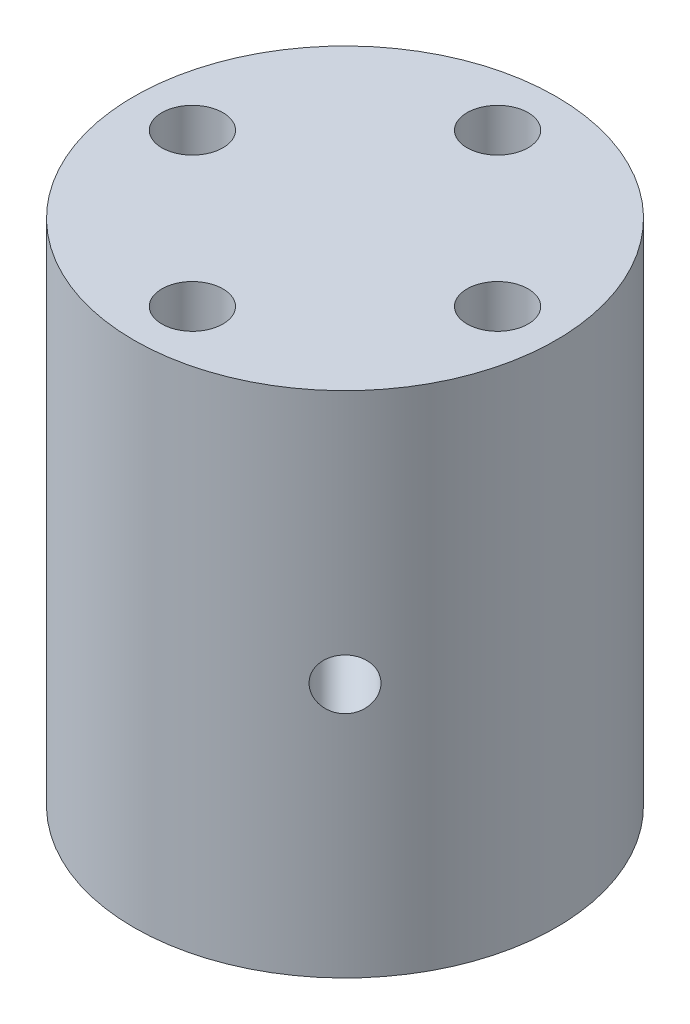
ISO-10303-21;
HEADER;
FILE_DESCRIPTION(('STEP AP214'),'2;1');
FILE_NAME('part.step','',(''),(''),'','','');
FILE_SCHEMA(('AUTOMOTIVE_DESIGN { 1 0 10303 214 1 1 1 1 }'));
ENDSEC;
DATA;
#1=APPLICATION_CONTEXT('core data for automotive mechanical design processes');
#2=APPLICATION_PROTOCOL_DEFINITION('international standard','automotive_design',2000,#1);
#3=PRODUCT_CONTEXT('',#1,'mechanical');
#4=PRODUCT('Part','Part','',(#3));
#5=PRODUCT_RELATED_PRODUCT_CATEGORY('part','',(#4));
#6=PRODUCT_DEFINITION_FORMATION('','',#4);
#7=PRODUCT_DEFINITION_CONTEXT('part definition',#1,'design');
#8=PRODUCT_DEFINITION('design','',#6,#7);
#9=PRODUCT_DEFINITION_SHAPE('','',#8);
#10=(LENGTH_UNIT() NAMED_UNIT(*) SI_UNIT(.MILLI.,.METRE.));
#11=(NAMED_UNIT(*) PLANE_ANGLE_UNIT() SI_UNIT($,.RADIAN.));
#12=(NAMED_UNIT(*) SI_UNIT($,.STERADIAN.) SOLID_ANGLE_UNIT());
#13=UNCERTAINTY_MEASURE_WITH_UNIT(LENGTH_MEASURE(1.E-05),#10,'distance_accuracy_value','');
#14=(GEOMETRIC_REPRESENTATION_CONTEXT(3) GLOBAL_UNCERTAINTY_ASSIGNED_CONTEXT((#13)) GLOBAL_UNIT_ASSIGNED_CONTEXT((#10,
#11,#12)) REPRESENTATION_CONTEXT('',''));
#15=CARTESIAN_POINT('',(0.,0.,0.));
#16=DIRECTION('',(0.,0.,1.));
#17=DIRECTION('',(1.,0.,0.));
#18=AXIS2_PLACEMENT_3D('',#15,#16,#17);
#19=CARTESIAN_POINT('',(0.,25.,0.));
#20=DIRECTION('',(0.,-1.,0.));
#21=DIRECTION('',(0.,0.,-1.));
#22=AXIS2_PLACEMENT_3D('',#19,#20,#21);
#23=CYLINDRICAL_SURFACE('',#22,10.375);
#24=CARTESIAN_POINT('',(-6.39890874216484,12.5,-8.16667569513118));
#25=CARTESIAN_POINT('',(-6.39891154089211,12.5699391173914,-8.16667427177952));
#26=CARTESIAN_POINT('',(-6.40358247484263,12.6399224468724,-8.16302031034799));
#27=CARTESIAN_POINT('',(-6.42210039944949,12.7779429061025,-8.14845904761087));
#28=CARTESIAN_POINT('',(-6.43595708190464,12.8459779010037,-8.13754408524727));
#29=CARTESIAN_POINT('',(-6.47230798956442,12.978083312131,-8.10866140554251));
#30=CARTESIAN_POINT('',(-6.49479647578836,13.0421563297413,-8.09069837403692));
#31=CARTESIAN_POINT('',(-6.5475703216428,13.1645803922889,-8.04804904711777));
#32=CARTESIAN_POINT('',(-6.57785430605795,13.2229324439656,-8.02336393751152));
#33=CARTESIAN_POINT('',(-6.645293320083,13.3325744824244,-7.96759809880234));
#34=CARTESIAN_POINT('',(-6.68247964507917,13.3838303690704,-7.93648816397078));
#35=CARTESIAN_POINT('',(-6.76233721005145,13.4775307229728,-7.86855532648686));
#36=CARTESIAN_POINT('',(-6.80500871830821,13.5199747589752,-7.83173214438095));
#37=CARTESIAN_POINT('',(-6.89454044791258,13.5949681586704,-7.75303133287636));
#38=CARTESIAN_POINT('',(-6.94141311533498,13.6274867743933,-7.71113854702754));
#39=CARTESIAN_POINT('',(-7.03770008295615,13.6815093569917,-7.62336158146409));
#40=CARTESIAN_POINT('',(-7.08711429516507,13.7030137049059,-7.57747753989122));
#41=CARTESIAN_POINT('',(-7.18667938050284,13.7342957494894,-7.48311057077701));
#42=CARTESIAN_POINT('',(-7.23682549505209,13.744130036319,-7.43464138575934));
#43=CARTESIAN_POINT('',(-7.33658124852993,13.751968125605,-7.33621897801879));
#44=CARTESIAN_POINT('',(-7.38619090708207,13.7499723622812,-7.28626580983221));
#45=CARTESIAN_POINT('',(-7.48321150054099,13.7342524700575,-7.18658367291414));
#46=CARTESIAN_POINT('',(-7.53063250121661,13.7205892001374,-7.1368548845044));
#47=CARTESIAN_POINT('',(-7.62230677029678,13.6820172160672,-7.03886137374923));
#48=CARTESIAN_POINT('',(-7.66655998210517,13.657108301059,-6.99059667757036));
#49=CARTESIAN_POINT('',(-7.75093581973229,13.5966869860383,-6.89692733673128));
#50=CARTESIAN_POINT('',(-7.79104780065824,13.561148132246,-6.85153017367705));
#51=CARTESIAN_POINT('',(-7.86612448233865,13.4804949931639,-6.76520424037887));
#52=CARTESIAN_POINT('',(-7.90108896363182,13.4353802998126,-6.72427566067015));
#53=CARTESIAN_POINT('',(-7.9653577156446,13.3365149798066,-6.64802294292893));
#54=CARTESIAN_POINT('',(-7.99462463300279,13.2827113325686,-6.61273604461652));
#55=CARTESIAN_POINT('',(-8.04665035991987,13.1681778609735,-6.5493305334591));
#56=CARTESIAN_POINT('',(-8.06940915160002,13.1074480175898,-6.52121194030647));
#57=CARTESIAN_POINT('',(-8.1080016061926,12.9807403272261,-6.47316688968925));
#58=CARTESIAN_POINT('',(-8.12383265547643,12.9147605106647,-6.45324352420715));
#59=CARTESIAN_POINT('',(-8.14826618806097,12.7794493504251,-6.42236516953996));
#60=CARTESIAN_POINT('',(-8.1568689942041,12.7101181565793,-6.41140977980957));
#61=CARTESIAN_POINT('',(-8.16665955759412,12.5705375908634,-6.39893430640159));
#62=CARTESIAN_POINT('',(-8.16789345594521,12.5002966983874,-6.39735551064996));
#63=CARTESIAN_POINT('',(-8.16304739475467,12.3604827061468,-6.40353785430568));
#64=CARTESIAN_POINT('',(-8.15696757977726,12.2909095932103,-6.41129880910178));
#65=CARTESIAN_POINT('',(-8.13763418155867,12.1546270739253,-6.43581967951247));
#66=CARTESIAN_POINT('',(-8.12440301438145,12.0879094185811,-6.45255147453132));
#67=CARTESIAN_POINT('',(-8.09101862199573,11.9589739471632,-6.49436326066546));
#68=CARTESIAN_POINT('',(-8.07086516999174,11.8967562786039,-6.51944352530164));
#69=CARTESIAN_POINT('',(-8.02388636503463,11.7782509744571,-6.57717714599622));
#70=CARTESIAN_POINT('',(-7.99702871539336,11.7219939790415,-6.60986710790959));
#71=CARTESIAN_POINT('',(-7.93720012281331,11.6173192028496,-6.681590725392));
#72=CARTESIAN_POINT('',(-7.90422895926089,11.5689017050892,-6.72062460988298));
#73=CARTESIAN_POINT('',(-7.83264429475469,11.4810208075757,-6.80392049186991));
#74=CARTESIAN_POINT('',(-7.79400190866115,11.4416060581151,-6.84820901722718));
#75=CARTESIAN_POINT('',(-7.71205139137585,11.3731857595573,-6.94036636452378));
#76=CARTESIAN_POINT('',(-7.66874334849382,11.3441800134875,-6.98823511869269));
#77=CARTESIAN_POINT('',(-7.57860886748938,11.2974818408044,-7.08588121053625));
#78=CARTESIAN_POINT('',(-7.53179158395452,11.2797610493531,-7.13565342699532));
#79=CARTESIAN_POINT('',(-7.43575661981332,11.2560434775358,-7.23567221709084));
#80=CARTESIAN_POINT('',(-7.38653903947215,11.250046207884,-7.28591877084269));
#81=CARTESIAN_POINT('',(-7.28739335211641,11.2499546137136,-7.3850801166557));
#82=CARTESIAN_POINT('',(-7.23747171588608,11.2557851744907,-7.43400132599505));
#83=CARTESIAN_POINT('',(-7.1380768955065,11.2790249538295,-7.52949098434799));
#84=CARTESIAN_POINT('',(-7.08860371119515,11.2964341682053,-7.57605943421214));
#85=CARTESIAN_POINT('',(-6.99163713232038,11.3423140099138,-7.66563724911901));
#86=CARTESIAN_POINT('',(-6.94414314654363,11.3707813074391,-7.70864768082681));
#87=CARTESIAN_POINT('',(-6.85262606688713,11.4379614473246,-7.79011547219686));
#88=CARTESIAN_POINT('',(-6.80860300235291,11.4766743762962,-7.8285727933654));
#89=CARTESIAN_POINT('',(-6.72521659172878,11.5635256540314,-7.90032505010518));
#90=CARTESIAN_POINT('',(-6.68588323575865,11.6117199328331,-7.93358714243547));
#91=CARTESIAN_POINT('',(-6.61353153917336,11.7160503701426,-7.99400108201421));
#92=CARTESIAN_POINT('',(-6.58051469990478,11.7721884112678,-8.0211514768689));
#93=CARTESIAN_POINT('',(-6.52187951357402,11.8910426328447,-8.06890029204849));
#94=CARTESIAN_POINT('',(-6.49628817598141,11.9537817241934,-8.08947482022807));
#95=CARTESIAN_POINT('',(-6.45364095927438,12.0838579757672,-8.12353956381605));
#96=CARTESIAN_POINT('',(-6.43657572920803,12.1511900061605,-8.13703754119009));
#97=CARTESIAN_POINT('',(-6.4157416249637,12.2657310579037,-8.15346498382468));
#98=CARTESIAN_POINT('',(-6.40944066255573,12.3122155052239,-8.15841432859552));
#99=CARTESIAN_POINT('',(-6.40102329283336,12.405793283578,-8.16502015237656));
#100=CARTESIAN_POINT('',(-6.39890685684611,12.4528866104374,-8.16667665394971));
#101=CARTESIAN_POINT('',(-6.39890874216484,12.5,-8.16667569513118));
#102=B_SPLINE_CURVE_WITH_KNOTS('',3,(#24,#25,#26,#27,#28,#29,#30,#31,#32,#33,#34,#35,#36,#37,
#38,#39,#40,#41,#42,#43,#44,#45,#46,#47,#48,#49,#50,#51,#52,#53,#54,#55,#56,#57,#58,#59,#60,#61,
#62,#63,#64,#65,#66,#67,#68,#69,#70,#71,#72,#73,#74,#75,#76,#77,#78,#79,#80,#81,#82,#83,#84,#85,
#86,#87,#88,#89,#90,#91,#92,#93,#94,#95,#96,#97,#98,#99,#100,#101),.UNSPECIFIED.,.T.,.F.,(4,2,2,
2,2,2,2,2,2,2,2,2,2,2,2,2,2,2,2,2,2,2,2,2,2,2,2,2,2,2,2,2,2,2,2,2,2,2,4),(0.,0.209645252086976,
0.419512051757651,0.62923955944555,0.838930094119506,1.049595684738,1.26027158294731,
1.47159366066174,1.68290842719411,1.8931942488768,2.10347235210555,2.31266027523479,
2.5218519348129,2.73156858482641,2.94129417342612,3.1523515596764,3.36340952572583,
3.57454704908685,3.78567514169542,3.99547983825288,4.20528038784005,4.41442709504608,
4.6235806551999,4.83376191906522,5.04395076905533,5.25524992363505,5.46654507952903,
5.67730702478736,5.88806017362751,6.09747908814701,6.30689792695782,6.51625375443917,
6.72561135176739,6.93624311900084,7.1469248883924,7.35836364983245,7.5695700053547,
7.71079520921233,7.85201944537535),.UNSPECIFIED.);
#103=CARTESIAN_POINT('',(-6.39890874216484,12.5,-8.16667569513118));
#104=VERTEX_POINT('',#103);
#105=EDGE_CURVE('E39',#104,#104,#102,.T.);
#106=ORIENTED_EDGE('',*,*,#105,.T.);
#107=EDGE_LOOP('',(#106));
#108=FACE_BOUND('',#107,.T.);
#109=CARTESIAN_POINT('',(8.16667569513121,12.5,6.39890874216481));
#110=CARTESIAN_POINT('',(8.16667427177954,12.4300608826086,6.39891154089208));
#111=CARTESIAN_POINT('',(8.16302031034801,12.3600775531276,6.40358247484261));
#112=CARTESIAN_POINT('',(8.14845904761089,12.2220570938975,6.42210039944946));
#113=CARTESIAN_POINT('',(8.13754408524729,12.1540220989963,6.43595708190461));
#114=CARTESIAN_POINT('',(8.10866140554253,12.021916687869,6.47230798956439));
#115=CARTESIAN_POINT('',(8.09069837403695,11.9578436702587,6.49479647578833));
#116=CARTESIAN_POINT('',(8.04804904711779,11.8354196077111,6.54757032164277));
#117=CARTESIAN_POINT('',(8.02336393751154,11.7770675560344,6.57785430605792));
#118=CARTESIAN_POINT('',(7.96759809880235,11.6674255175756,6.64529332008297));
#119=CARTESIAN_POINT('',(7.93648816397081,11.6161696309296,6.68247964507915));
#120=CARTESIAN_POINT('',(7.86855532648689,11.5224692770272,6.76233721005142));
#121=CARTESIAN_POINT('',(7.83173214438098,11.4800252410248,6.80500871830818));
#122=CARTESIAN_POINT('',(7.75303133287638,11.4050318413296,6.89454044791255));
#123=CARTESIAN_POINT('',(7.71113854702756,11.3725132256067,6.94141311533496));
#124=CARTESIAN_POINT('',(7.62336158146411,11.3184906430083,7.03770008295612));
#125=CARTESIAN_POINT('',(7.57747753989125,11.2969862950941,7.08711429516504));
#126=CARTESIAN_POINT('',(7.48311057077704,11.2657042505106,7.18667938050282));
#127=CARTESIAN_POINT('',(7.43464138575936,11.255869963681,7.23682549505207));
#128=CARTESIAN_POINT('',(7.33621897801881,11.248031874395,7.33658124852991));
#129=CARTESIAN_POINT('',(7.28626580983224,11.2500276377188,7.38619090708205));
#130=CARTESIAN_POINT('',(7.18658367291416,11.2657475299425,7.48321150054096));
#131=CARTESIAN_POINT('',(7.13685488450442,11.2794107998626,7.53063250121658));
#132=CARTESIAN_POINT('',(7.03886137374925,11.3179827839328,7.62230677029676));
#133=CARTESIAN_POINT('',(6.99059667757038,11.342891698941,7.66655998210514));
#134=CARTESIAN_POINT('',(6.8969273367313,11.4033130139617,7.75093581973227));
#135=CARTESIAN_POINT('',(6.85153017367707,11.438851867754,7.79104780065821));
#136=CARTESIAN_POINT('',(6.76520424037889,11.5195050068361,7.86612448233863));
#137=CARTESIAN_POINT('',(6.72427566067018,11.5646197001874,7.9010889636318));
#138=CARTESIAN_POINT('',(6.64802294292895,11.6634850201934,7.96535771564458));
#139=CARTESIAN_POINT('',(6.61273604461655,11.7172886674314,7.99462463300276));
#140=CARTESIAN_POINT('',(6.54933053345913,11.8318221390265,8.04665035991985));
#141=CARTESIAN_POINT('',(6.52121194030649,11.8925519824102,8.0694091516));
#142=CARTESIAN_POINT('',(6.47316688968928,12.0192596727739,8.10800160619257));
#143=CARTESIAN_POINT('',(6.45324352420718,12.0852394893353,8.12383265547641));
#144=CARTESIAN_POINT('',(6.42236516953999,12.2205506495749,8.14826618806095));
#145=CARTESIAN_POINT('',(6.4114097798096,12.2898818434207,8.15686899420408));
#146=CARTESIAN_POINT('',(6.39893430640161,12.4294624091366,8.1666595575941));
#147=CARTESIAN_POINT('',(6.39735551064999,12.4997033016126,8.16789345594518));
#148=CARTESIAN_POINT('',(6.40353785430571,12.6395172938532,8.16304739475465));
#149=CARTESIAN_POINT('',(6.41129880910181,12.7090904067897,8.15696757977724));
#150=CARTESIAN_POINT('',(6.4358196795125,12.8453729260747,8.13763418155865));
#151=CARTESIAN_POINT('',(6.45255147453135,12.912090581419,8.12440301438143));
#152=CARTESIAN_POINT('',(6.49436326066548,13.0410260528368,8.09101862199571));
#153=CARTESIAN_POINT('',(6.51944352530167,13.1032437213961,8.07086516999171));
#154=CARTESIAN_POINT('',(6.57717714599625,13.2217490255429,8.0238863650346));
#155=CARTESIAN_POINT('',(6.60986710790962,13.2780060209585,7.99702871539334));
#156=CARTESIAN_POINT('',(6.68159072539203,13.3826807971504,7.93720012281329));
#157=CARTESIAN_POINT('',(6.72062460988301,13.4310982949108,7.90422895926087));
#158=CARTESIAN_POINT('',(6.80392049186994,13.5189791924243,7.83264429475467));
#159=CARTESIAN_POINT('',(6.84820901722721,13.5583939418849,7.79400190866112));
#160=CARTESIAN_POINT('',(6.94036636452381,13.6268142404427,7.71205139137582));
#161=CARTESIAN_POINT('',(6.98823511869272,13.6558199865125,7.66874334849379));
#162=CARTESIAN_POINT('',(7.08588121053628,13.7025181591957,7.57860886748935));
#163=CARTESIAN_POINT('',(7.13565342699535,13.7202389506469,7.5317915839545));
#164=CARTESIAN_POINT('',(7.23567221709087,13.7439565224642,7.43575661981329));
#165=CARTESIAN_POINT('',(7.28591877084272,13.749953792116,7.38653903947212));
#166=CARTESIAN_POINT('',(7.38508011665573,13.7500453862864,7.28739335211639));
#167=CARTESIAN_POINT('',(7.43400132599507,13.7442148255093,7.23747171588605));
#168=CARTESIAN_POINT('',(7.52949098434801,13.7209750461705,7.13807689550648));
#169=CARTESIAN_POINT('',(7.57605943421216,13.7035658317947,7.08860371119513));
#170=CARTESIAN_POINT('',(7.66563724911903,13.6576859900862,6.99163713232036));
#171=CARTESIAN_POINT('',(7.70864768082683,13.6292186925609,6.94414314654361));
#172=CARTESIAN_POINT('',(7.79011547219689,13.5620385526754,6.8526260668871));
#173=CARTESIAN_POINT('',(7.82857279336543,13.5233256237038,6.80860300235288));
#174=CARTESIAN_POINT('',(7.90032505010521,13.4364743459686,6.72521659172875));
#175=CARTESIAN_POINT('',(7.93358714243549,13.3882800671669,6.68588323575863));
#176=CARTESIAN_POINT('',(7.99400108201423,13.2839496298574,6.61353153917333));
#177=CARTESIAN_POINT('',(8.02115147686893,13.2278115887322,6.58051469990475));
#178=CARTESIAN_POINT('',(8.06890029204851,13.1089573671553,6.52187951357399));
#179=CARTESIAN_POINT('',(8.0894748202281,13.0462182758066,6.49628817598138));
#180=CARTESIAN_POINT('',(8.12353956381607,12.9161420242328,6.45364095927436));
#181=CARTESIAN_POINT('',(8.13703754119011,12.8488099938395,6.43657572920801));
#182=CARTESIAN_POINT('',(8.1534649838247,12.7342689420963,6.41574162496367));
#183=CARTESIAN_POINT('',(8.15841432859554,12.6877844947761,6.4094406625557));
#184=CARTESIAN_POINT('',(8.16502015237659,12.5942067164221,6.40102329283333));
#185=CARTESIAN_POINT('',(8.16667665394973,12.5471133895626,6.39890685684608));
#186=CARTESIAN_POINT('',(8.16667569513121,12.5,6.39890874216481));
#187=B_SPLINE_CURVE_WITH_KNOTS('',3,(#109,#110,#111,#112,#113,#114,#115,#116,#117,#118,#119,
#120,#121,#122,#123,#124,#125,#126,#127,#128,#129,#130,#131,#132,#133,#134,#135,#136,#137,#138,
#139,#140,#141,#142,#143,#144,#145,#146,#147,#148,#149,#150,#151,#152,#153,#154,#155,#156,#157,
#158,#159,#160,#161,#162,#163,#164,#165,#166,#167,#168,#169,#170,#171,#172,#173,#174,#175,#176,
#177,#178,#179,#180,#181,#182,#183,#184,#185,#186),.UNSPECIFIED.,.T.,.F.,(4,2,2,2,2,2,2,2,2,2,2,
2,2,2,2,2,2,2,2,2,2,2,2,2,2,2,2,2,2,2,2,2,2,2,2,2,2,2,4),(0.,0.209645252086977,
0.419512051757651,0.629239559445551,0.838930094119507,1.049595684738,1.26027158294731,
1.47159366066174,1.68290842719411,1.8931942488768,2.10347235210555,2.31266027523479,
2.52185193481291,2.73156858482641,2.94129417342612,3.15235155967641,3.36340952572583,
3.57454704908685,3.78567514169542,3.99547983825288,4.20528038784006,4.41442709504608,
4.6235806551999,4.83376191906522,5.04395076905533,5.25524992363505,5.46654507952903,
5.67730702478736,5.88806017362751,6.09747908814701,6.30689792695782,6.51625375443917,
6.72561135176739,6.93624311900084,7.14692488839241,7.35836364983244,7.5695700053547,
7.71079520921233,7.85201944537535),.UNSPECIFIED.);
#188=CARTESIAN_POINT('',(8.16667569513121,12.5,6.39890874216481));
#189=VERTEX_POINT('',#188);
#190=EDGE_CURVE('E57',#189,#189,#187,.T.);
#191=ORIENTED_EDGE('',*,*,#190,.T.);
#192=EDGE_LOOP('',(#191));
#193=FACE_BOUND('',#192,.T.);
#194=CARTESIAN_POINT('',(0.,25.,0.));
#195=DIRECTION('',(0.,1.,0.));
#196=DIRECTION('',(0.,0.,1.));
#197=AXIS2_PLACEMENT_3D('',#194,#195,#196);
#198=CIRCLE('',#197,10.375);
#199=CARTESIAN_POINT('',(0.,25.,10.375));
#200=VERTEX_POINT('',#199);
#201=EDGE_CURVE('E10',#200,#200,#198,.T.);
#202=ORIENTED_EDGE('',*,*,#201,.F.);
#203=EDGE_LOOP('',(#202));
#204=FACE_BOUND('',#203,.T.);
#205=CARTESIAN_POINT('',(0.,0.,0.));
#206=DIRECTION('',(0.,1.,0.));
#207=DIRECTION('',(0.,0.,1.));
#208=AXIS2_PLACEMENT_3D('',#205,#206,#207);
#209=CIRCLE('',#208,10.375);
#210=CARTESIAN_POINT('',(0.,0.,10.375));
#211=VERTEX_POINT('',#210);
#212=EDGE_CURVE('E47',#211,#211,#209,.T.);
#213=ORIENTED_EDGE('',*,*,#212,.T.);
#214=EDGE_LOOP('',(#213));
#215=FACE_BOUND('',#214,.T.);
#216=ADVANCED_FACE('F35',(#108,#193,#204,#215),#23,.T.);
#217=CARTESIAN_POINT('',(0.,25.,0.));
#218=DIRECTION('',(0.,1.,0.));
#219=DIRECTION('',(0.,0.,1.));
#220=AXIS2_PLACEMENT_3D('',#217,#218,#219);
#221=PLANE('',#220);
#222=CARTESIAN_POINT('',(0.,25.,-7.5));
#223=DIRECTION('',(0.,1.,0.));
#224=DIRECTION('',(0.,0.,1.));
#225=AXIS2_PLACEMENT_3D('',#222,#223,#224);
#226=CIRCLE('',#225,1.5);
#227=CARTESIAN_POINT('',(0.,25.,-6.));
#228=VERTEX_POINT('',#227);
#229=EDGE_CURVE('E127',#228,#228,#226,.T.);
#230=ORIENTED_EDGE('',*,*,#229,.F.);
#231=EDGE_LOOP('',(#230));
#232=FACE_BOUND('',#231,.T.);
#233=CARTESIAN_POINT('',(-7.5,25.,0.));
#234=DIRECTION('',(0.,1.,0.));
#235=DIRECTION('',(0.,0.,1.));
#236=AXIS2_PLACEMENT_3D('',#233,#234,#235);
#237=CIRCLE('',#236,1.5);
#238=CARTESIAN_POINT('',(-7.5,25.,1.5));
#239=VERTEX_POINT('',#238);
#240=EDGE_CURVE('E121',#239,#239,#237,.T.);
#241=ORIENTED_EDGE('',*,*,#240,.F.);
#242=EDGE_LOOP('',(#241));
#243=FACE_BOUND('',#242,.T.);
#244=CARTESIAN_POINT('',(7.5,25.,0.));
#245=DIRECTION('',(0.,1.,0.));
#246=DIRECTION('',(0.,0.,1.));
#247=AXIS2_PLACEMENT_3D('',#244,#245,#246);
#248=CIRCLE('',#247,1.5);
#249=CARTESIAN_POINT('',(7.5,25.,1.5));
#250=VERTEX_POINT('',#249);
#251=EDGE_CURVE('E112',#250,#250,#248,.T.);
#252=ORIENTED_EDGE('',*,*,#251,.F.);
#253=EDGE_LOOP('',(#252));
#254=FACE_BOUND('',#253,.T.);
#255=CARTESIAN_POINT('',(0.,25.,7.5));
#256=DIRECTION('',(0.,1.,0.));
#257=DIRECTION('',(0.,0.,1.));
#258=AXIS2_PLACEMENT_3D('',#255,#256,#257);
#259=CIRCLE('',#258,1.5);
#260=CARTESIAN_POINT('',(0.,25.,9.));
#261=VERTEX_POINT('',#260);
#262=EDGE_CURVE('E55',#261,#261,#259,.T.);
#263=ORIENTED_EDGE('',*,*,#262,.F.);
#264=EDGE_LOOP('',(#263));
#265=FACE_BOUND('',#264,.T.);
#266=ORIENTED_EDGE('',*,*,#201,.T.);
#267=EDGE_LOOP('',(#266));
#268=FACE_BOUND('',#267,.T.);
#269=ADVANCED_FACE('F85',(#232,#243,#254,#265,#268),#221,.T.);
#270=CARTESIAN_POINT('',(0.,0.,0.));
#271=DIRECTION('',(0.,1.,0.));
#272=DIRECTION('',(0.,0.,1.));
#273=AXIS2_PLACEMENT_3D('',#270,#271,#272);
#274=PLANE('',#273);
#275=CARTESIAN_POINT('',(0.,0.,-7.5));
#276=DIRECTION('',(0.,1.,0.));
#277=DIRECTION('',(0.,0.,1.));
#278=AXIS2_PLACEMENT_3D('',#275,#276,#277);
#279=CIRCLE('',#278,1.5);
#280=CARTESIAN_POINT('',(0.,0.,-6.));
#281=VERTEX_POINT('',#280);
#282=EDGE_CURVE('E52',#281,#281,#279,.T.);
#283=ORIENTED_EDGE('',*,*,#282,.T.);
#284=EDGE_LOOP('',(#283));
#285=FACE_BOUND('',#284,.T.);
#286=CARTESIAN_POINT('',(-7.5,0.,0.));
#287=DIRECTION('',(0.,1.,0.));
#288=DIRECTION('',(0.,0.,1.));
#289=AXIS2_PLACEMENT_3D('',#286,#287,#288);
#290=CIRCLE('',#289,1.5);
#291=CARTESIAN_POINT('',(-7.5,0.,1.5));
#292=VERTEX_POINT('',#291);
#293=EDGE_CURVE('E124',#292,#292,#290,.T.);
#294=ORIENTED_EDGE('',*,*,#293,.T.);
#295=EDGE_LOOP('',(#294));
#296=FACE_BOUND('',#295,.T.);
#297=CARTESIAN_POINT('',(7.5,0.,0.));
#298=DIRECTION('',(0.,1.,0.));
#299=DIRECTION('',(0.,0.,1.));
#300=AXIS2_PLACEMENT_3D('',#297,#298,#299);
#301=CIRCLE('',#300,1.5);
#302=CARTESIAN_POINT('',(7.5,0.,1.5));
#303=VERTEX_POINT('',#302);
#304=EDGE_CURVE('E116',#303,#303,#301,.T.);
#305=ORIENTED_EDGE('',*,*,#304,.T.);
#306=EDGE_LOOP('',(#305));
#307=FACE_BOUND('',#306,.T.);
#308=CARTESIAN_POINT('',(0.,0.,7.5));
#309=DIRECTION('',(0.,1.,0.));
#310=DIRECTION('',(0.,0.,1.));
#311=AXIS2_PLACEMENT_3D('',#308,#309,#310);
#312=CIRCLE('',#311,1.5);
#313=CARTESIAN_POINT('',(0.,0.,9.));
#314=VERTEX_POINT('',#313);
#315=EDGE_CURVE('E108',#314,#314,#312,.T.);
#316=ORIENTED_EDGE('',*,*,#315,.T.);
#317=EDGE_LOOP('',(#316));
#318=FACE_BOUND('',#317,.T.);
#319=ORIENTED_EDGE('',*,*,#212,.F.);
#320=EDGE_LOOP('',(#319));
#321=FACE_BOUND('',#320,.T.);
#322=ADVANCED_FACE('F83',(#285,#296,#307,#318,#321),#274,.F.);
#323=CARTESIAN_POINT('',(0.,0.,7.5));
#324=DIRECTION('',(0.,1.,0.));
#325=DIRECTION('',(0.,0.,1.));
#326=AXIS2_PLACEMENT_3D('',#323,#324,#325);
#327=CYLINDRICAL_SURFACE('',#326,1.5);
#328=ORIENTED_EDGE('',*,*,#315,.F.);
#329=EDGE_LOOP('',(#328));
#330=FACE_BOUND('',#329,.T.);
#331=ORIENTED_EDGE('',*,*,#262,.T.);
#332=EDGE_LOOP('',(#331));
#333=FACE_BOUND('',#332,.T.);
#334=ADVANCED_FACE('F79',(#330,#333),#327,.F.);
#335=CARTESIAN_POINT('',(7.5,0.,0.));
#336=DIRECTION('',(0.,1.,0.));
#337=DIRECTION('',(0.,0.,1.));
#338=AXIS2_PLACEMENT_3D('',#335,#336,#337);
#339=CYLINDRICAL_SURFACE('',#338,1.5);
#340=ORIENTED_EDGE('',*,*,#304,.F.);
#341=EDGE_LOOP('',(#340));
#342=FACE_BOUND('',#341,.T.);
#343=ORIENTED_EDGE('',*,*,#251,.T.);
#344=EDGE_LOOP('',(#343));
#345=FACE_BOUND('',#344,.T.);
#346=ADVANCED_FACE('F75',(#342,#345),#339,.F.);
#347=CARTESIAN_POINT('',(-7.5,0.,0.));
#348=DIRECTION('',(0.,1.,0.));
#349=DIRECTION('',(0.,0.,1.));
#350=AXIS2_PLACEMENT_3D('',#347,#348,#349);
#351=CYLINDRICAL_SURFACE('',#350,1.5);
#352=ORIENTED_EDGE('',*,*,#293,.F.);
#353=EDGE_LOOP('',(#352));
#354=FACE_BOUND('',#353,.T.);
#355=ORIENTED_EDGE('',*,*,#240,.T.);
#356=EDGE_LOOP('',(#355));
#357=FACE_BOUND('',#356,.T.);
#358=ADVANCED_FACE('F71',(#354,#357),#351,.F.);
#359=CARTESIAN_POINT('',(0.,0.,-7.5));
#360=DIRECTION('',(0.,1.,0.));
#361=DIRECTION('',(0.,0.,1.));
#362=AXIS2_PLACEMENT_3D('',#359,#360,#361);
#363=CYLINDRICAL_SURFACE('',#362,1.5);
#364=ORIENTED_EDGE('',*,*,#282,.F.);
#365=EDGE_LOOP('',(#364));
#366=FACE_BOUND('',#365,.T.);
#367=ORIENTED_EDGE('',*,*,#229,.T.);
#368=EDGE_LOOP('',(#367));
#369=FACE_BOUND('',#368,.T.);
#370=ADVANCED_FACE('F66',(#366,#369),#363,.F.);
#371=CARTESIAN_POINT('',(-10.375,12.5,-10.375));
#372=DIRECTION('',(0.707106781186549,0.,0.707106781186546));
#373=DIRECTION('',(0.707106781186546,0.,-0.707106781186549));
#374=AXIS2_PLACEMENT_3D('',#371,#372,#373);
#375=CYLINDRICAL_SURFACE('',#374,1.25);
#376=ORIENTED_EDGE('',*,*,#190,.F.);
#377=EDGE_LOOP('',(#376));
#378=FACE_BOUND('',#377,.T.);
#379=ORIENTED_EDGE('',*,*,#105,.F.);
#380=EDGE_LOOP('',(#379));
#381=FACE_BOUND('',#380,.T.);
#382=ADVANCED_FACE('F62',(#378,#381),#375,.F.);
#383=CLOSED_SHELL('',(#216,#269,#322,#334,#346,#358,#370,#382));
#384=MANIFOLD_SOLID_BREP('B2',#383);
#385=ADVANCED_BREP_SHAPE_REPRESENTATION('',(#18,#384),#14);
#386=SHAPE_DEFINITION_REPRESENTATION(#9,#385);
ENDSEC;
END-ISO-10303-21;
